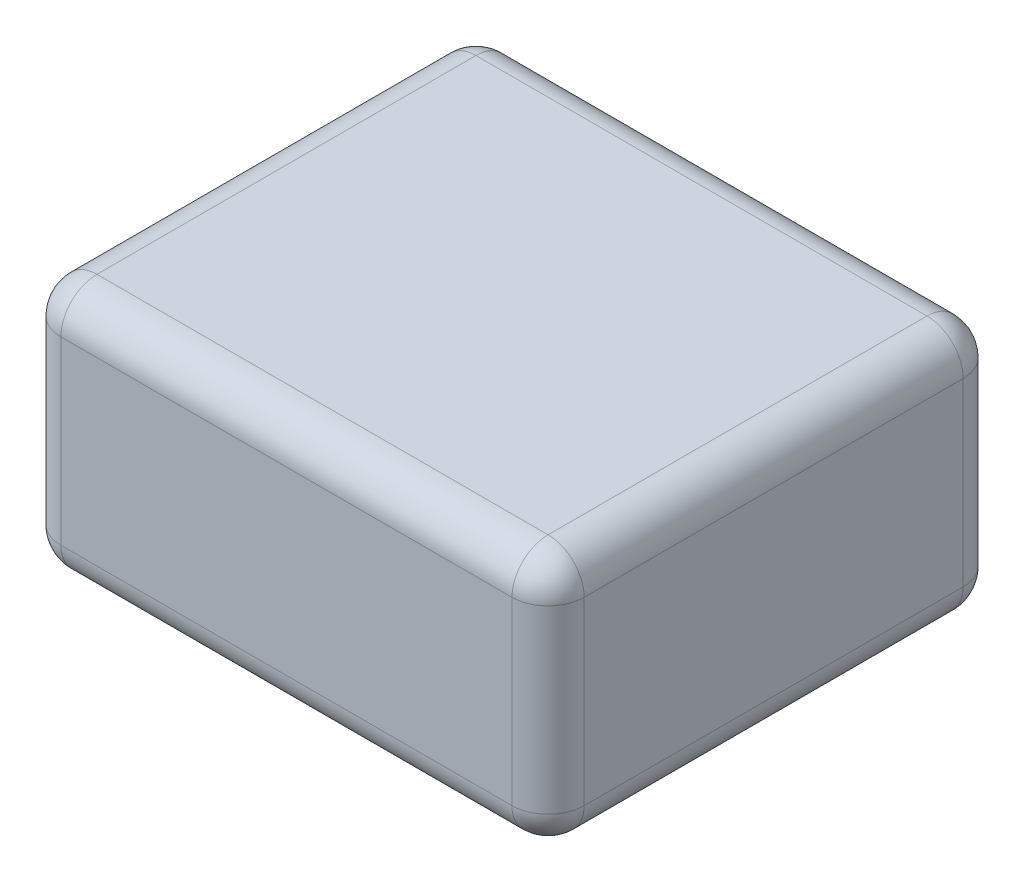
ISO-10303-21;
HEADER;
FILE_DESCRIPTION(('STEP AP214'),'2;1');
FILE_NAME('part.step','',(''),(''),'','','');
FILE_SCHEMA(('AUTOMOTIVE_DESIGN { 1 0 10303 214 1 1 1 1 }'));
ENDSEC;
DATA;
#1=APPLICATION_CONTEXT('core data for automotive mechanical design processes');
#2=APPLICATION_PROTOCOL_DEFINITION('international standard','automotive_design',2000,#1);
#3=PRODUCT_CONTEXT('',#1,'mechanical');
#4=PRODUCT('Part','Part','',(#3));
#5=PRODUCT_RELATED_PRODUCT_CATEGORY('part','',(#4));
#6=PRODUCT_DEFINITION_FORMATION('','',#4);
#7=PRODUCT_DEFINITION_CONTEXT('part definition',#1,'design');
#8=PRODUCT_DEFINITION('design','',#6,#7);
#9=PRODUCT_DEFINITION_SHAPE('','',#8);
#10=(LENGTH_UNIT() NAMED_UNIT(*) SI_UNIT(.MILLI.,.METRE.));
#11=(NAMED_UNIT(*) PLANE_ANGLE_UNIT() SI_UNIT($,.RADIAN.));
#12=(NAMED_UNIT(*) SI_UNIT($,.STERADIAN.) SOLID_ANGLE_UNIT());
#13=UNCERTAINTY_MEASURE_WITH_UNIT(LENGTH_MEASURE(1.E-05),#10,'distance_accuracy_value','');
#14=(GEOMETRIC_REPRESENTATION_CONTEXT(3) GLOBAL_UNCERTAINTY_ASSIGNED_CONTEXT((#13)) GLOBAL_UNIT_ASSIGNED_CONTEXT((#10,
#11,#12)) REPRESENTATION_CONTEXT('',''));
#15=CARTESIAN_POINT('',(0.,0.,0.));
#16=DIRECTION('',(0.,0.,1.));
#17=DIRECTION('',(1.,0.,0.));
#18=AXIS2_PLACEMENT_3D('',#15,#16,#17);
#19=CARTESIAN_POINT('',(92.075,88.9,-79.375));
#20=DIRECTION('',(-1.,0.,0.));
#21=DIRECTION('',(0.,0.,1.));
#22=AXIS2_PLACEMENT_3D('',#19,#20,#21);
#23=PLANE('',#22);
#24=DIRECTION('',(0.,0.,-1.));
#25=VECTOR('',#24,1.);
#26=CARTESIAN_POINT('',(92.075,12.7,-79.375));
#27=LINE('',#26,#25);
#28=CARTESIAN_POINT('',(92.075,12.7,66.675));
#29=VERTEX_POINT('',#28);
#30=CARTESIAN_POINT('',(92.075,12.7,-66.675));
#31=VERTEX_POINT('',#30);
#32=EDGE_CURVE('E183',#29,#31,#27,.T.);
#33=ORIENTED_EDGE('',*,*,#32,.T.);
#34=DIRECTION('',(0.,-1.,0.));
#35=VECTOR('',#34,1.);
#36=CARTESIAN_POINT('',(92.075,88.9,-66.675));
#37=LINE('',#36,#35);
#38=CARTESIAN_POINT('',(92.075,76.2,-66.675));
#39=VERTEX_POINT('',#38);
#40=EDGE_CURVE('E185',#31,#39,#37,.F.);
#41=ORIENTED_EDGE('',*,*,#40,.T.);
#42=DIRECTION('',(0.,0.,-1.));
#43=VECTOR('',#42,1.);
#44=CARTESIAN_POINT('',(92.075,76.2,79.375));
#45=LINE('',#44,#43);
#46=CARTESIAN_POINT('',(92.075,76.2,66.675));
#47=VERTEX_POINT('',#46);
#48=EDGE_CURVE('E181',#39,#47,#45,.F.);
#49=ORIENTED_EDGE('',*,*,#48,.T.);
#50=DIRECTION('',(0.,-1.,0.));
#51=VECTOR('',#50,1.);
#52=CARTESIAN_POINT('',(92.075,88.9,66.675));
#53=LINE('',#52,#51);
#54=EDGE_CURVE('E179',#47,#29,#53,.T.);
#55=ORIENTED_EDGE('',*,*,#54,.T.);
#56=EDGE_LOOP('',(#33,#41,#49,#55));
#57=FACE_BOUND('',#56,.T.);
#58=ADVANCED_FACE('F35',(#57),#23,.F.);
#59=CARTESIAN_POINT('',(-92.075,88.9,-79.375));
#60=DIRECTION('',(0.,0.,1.));
#61=DIRECTION('',(1.,0.,0.));
#62=AXIS2_PLACEMENT_3D('',#59,#60,#61);
#63=PLANE('',#62);
#64=DIRECTION('',(-1.,0.,0.));
#65=VECTOR('',#64,1.);
#66=CARTESIAN_POINT('',(-92.075,12.7,-79.375));
#67=LINE('',#66,#65);
#68=CARTESIAN_POINT('',(79.375,12.7,-79.375));
#69=VERTEX_POINT('',#68);
#70=CARTESIAN_POINT('',(-79.375,12.7,-79.375));
#71=VERTEX_POINT('',#70);
#72=EDGE_CURVE('E174',#69,#71,#67,.T.);
#73=ORIENTED_EDGE('',*,*,#72,.T.);
#74=DIRECTION('',(0.,-1.,0.));
#75=VECTOR('',#74,1.);
#76=CARTESIAN_POINT('',(-79.375,88.9,-79.375));
#77=LINE('',#76,#75);
#78=CARTESIAN_POINT('',(-79.375,76.2,-79.375));
#79=VERTEX_POINT('',#78);
#80=EDGE_CURVE('E176',#71,#79,#77,.F.);
#81=ORIENTED_EDGE('',*,*,#80,.T.);
#82=DIRECTION('',(-1.,0.,0.));
#83=VECTOR('',#82,1.);
#84=CARTESIAN_POINT('',(92.075,76.2,-79.375));
#85=LINE('',#84,#83);
#86=CARTESIAN_POINT('',(79.375,76.2,-79.375));
#87=VERTEX_POINT('',#86);
#88=EDGE_CURVE('E170',#79,#87,#85,.F.);
#89=ORIENTED_EDGE('',*,*,#88,.T.);
#90=DIRECTION('',(0.,-1.,0.));
#91=VECTOR('',#90,1.);
#92=CARTESIAN_POINT('',(79.375,88.9,-79.375));
#93=LINE('',#92,#91);
#94=EDGE_CURVE('E172',#87,#69,#93,.T.);
#95=ORIENTED_EDGE('',*,*,#94,.T.);
#96=EDGE_LOOP('',(#73,#81,#89,#95));
#97=FACE_BOUND('',#96,.T.);
#98=ADVANCED_FACE('F288',(#97),#63,.F.);
#99=CARTESIAN_POINT('',(-92.075,88.9,-79.375));
#100=DIRECTION('',(1.,0.,0.));
#101=DIRECTION('',(0.,0.,-1.));
#102=AXIS2_PLACEMENT_3D('',#99,#100,#101);
#103=PLANE('',#102);
#104=DIRECTION('',(0.,-1.,0.));
#105=VECTOR('',#104,1.);
#106=CARTESIAN_POINT('',(-92.075,88.9,-66.675));
#107=LINE('',#106,#105);
#108=CARTESIAN_POINT('',(-92.075,76.2,-66.675));
#109=VERTEX_POINT('',#108);
#110=CARTESIAN_POINT('',(-92.075,12.7,-66.675));
#111=VERTEX_POINT('',#110);
#112=EDGE_CURVE('E157',#109,#111,#107,.T.);
#113=ORIENTED_EDGE('',*,*,#112,.T.);
#114=DIRECTION('',(0.,0.,1.));
#115=VECTOR('',#114,1.);
#116=CARTESIAN_POINT('',(-92.075,12.7,-79.375));
#117=LINE('',#116,#115);
#118=CARTESIAN_POINT('',(-92.075,12.7,66.675));
#119=VERTEX_POINT('',#118);
#120=EDGE_CURVE('E129',#111,#119,#117,.T.);
#121=ORIENTED_EDGE('',*,*,#120,.T.);
#122=DIRECTION('',(0.,-1.,0.));
#123=VECTOR('',#122,1.);
#124=CARTESIAN_POINT('',(-92.075,88.9,66.675));
#125=LINE('',#124,#123);
#126=CARTESIAN_POINT('',(-92.075,76.2,66.675));
#127=VERTEX_POINT('',#126);
#128=EDGE_CURVE('E147',#119,#127,#125,.F.);
#129=ORIENTED_EDGE('',*,*,#128,.T.);
#130=DIRECTION('',(0.,0.,1.));
#131=VECTOR('',#130,1.);
#132=CARTESIAN_POINT('',(-92.075,76.2,-79.375));
#133=LINE('',#132,#131);
#134=EDGE_CURVE('E153',#127,#109,#133,.F.);
#135=ORIENTED_EDGE('',*,*,#134,.T.);
#136=EDGE_LOOP('',(#113,#121,#129,#135));
#137=FACE_BOUND('',#136,.T.);
#138=ADVANCED_FACE('F155',(#137),#103,.F.);
#139=CARTESIAN_POINT('',(-92.075,88.9,79.375));
#140=DIRECTION('',(0.,0.,-1.));
#141=DIRECTION('',(-1.,0.,0.));
#142=AXIS2_PLACEMENT_3D('',#139,#140,#141);
#143=PLANE('',#142);
#144=DIRECTION('',(1.,0.,0.));
#145=VECTOR('',#144,1.);
#146=CARTESIAN_POINT('',(-92.075,76.2,79.375));
#147=LINE('',#146,#145);
#148=CARTESIAN_POINT('',(79.375,76.2,79.375));
#149=VERTEX_POINT('',#148);
#150=CARTESIAN_POINT('',(-79.375,76.2,79.375));
#151=VERTEX_POINT('',#150);
#152=EDGE_CURVE('E44',#149,#151,#147,.F.);
#153=ORIENTED_EDGE('',*,*,#152,.T.);
#154=DIRECTION('',(0.,-1.,0.));
#155=VECTOR('',#154,1.);
#156=CARTESIAN_POINT('',(-79.375,88.9,79.375));
#157=LINE('',#156,#155);
#158=CARTESIAN_POINT('',(-79.375,12.7,79.375));
#159=VERTEX_POINT('',#158);
#160=EDGE_CURVE('E11',#151,#159,#157,.T.);
#161=ORIENTED_EDGE('',*,*,#160,.T.);
#162=DIRECTION('',(1.,0.,0.));
#163=VECTOR('',#162,1.);
#164=CARTESIAN_POINT('',(-92.075,12.7,79.375));
#165=LINE('',#164,#163);
#166=CARTESIAN_POINT('',(79.375,12.7,79.375));
#167=VERTEX_POINT('',#166);
#168=EDGE_CURVE('E197',#159,#167,#165,.T.);
#169=ORIENTED_EDGE('',*,*,#168,.T.);
#170=DIRECTION('',(0.,-1.,0.));
#171=VECTOR('',#170,1.);
#172=CARTESIAN_POINT('',(79.375,88.9,79.375));
#173=LINE('',#172,#171);
#174=EDGE_CURVE('E55',#167,#149,#173,.F.);
#175=ORIENTED_EDGE('',*,*,#174,.T.);
#176=EDGE_LOOP('',(#153,#161,#169,#175));
#177=FACE_BOUND('',#176,.T.);
#178=ADVANCED_FACE('F328',(#177),#143,.F.);
#179=CARTESIAN_POINT('',(0.,88.9,0.));
#180=DIRECTION('',(0.,1.,0.));
#181=DIRECTION('',(0.,0.,1.));
#182=AXIS2_PLACEMENT_3D('',#179,#180,#181);
#183=PLANE('',#182);
#184=DIRECTION('',(-1.,0.,0.));
#185=VECTOR('',#184,1.);
#186=CARTESIAN_POINT('',(-92.075,88.9,-66.675));
#187=LINE('',#186,#185);
#188=CARTESIAN_POINT('',(79.375,88.9,-66.675));
#189=VERTEX_POINT('',#188);
#190=CARTESIAN_POINT('',(-79.375,88.9,-66.675));
#191=VERTEX_POINT('',#190);
#192=EDGE_CURVE('E192',#189,#191,#187,.T.);
#193=ORIENTED_EDGE('',*,*,#192,.T.);
#194=DIRECTION('',(0.,0.,1.));
#195=VECTOR('',#194,1.);
#196=CARTESIAN_POINT('',(-79.375,88.9,79.375));
#197=LINE('',#196,#195);
#198=CARTESIAN_POINT('',(-79.375,88.9,66.675));
#199=VERTEX_POINT('',#198);
#200=EDGE_CURVE('E194',#191,#199,#197,.T.);
#201=ORIENTED_EDGE('',*,*,#200,.T.);
#202=DIRECTION('',(1.,0.,0.));
#203=VECTOR('',#202,1.);
#204=CARTESIAN_POINT('',(92.075,88.9,66.675));
#205=LINE('',#204,#203);
#206=CARTESIAN_POINT('',(79.375,88.9,66.675));
#207=VERTEX_POINT('',#206);
#208=EDGE_CURVE('E188',#199,#207,#205,.T.);
#209=ORIENTED_EDGE('',*,*,#208,.T.);
#210=DIRECTION('',(0.,0.,-1.));
#211=VECTOR('',#210,1.);
#212=CARTESIAN_POINT('',(79.375,88.9,-79.375));
#213=LINE('',#212,#211);
#214=EDGE_CURVE('E190',#207,#189,#213,.T.);
#215=ORIENTED_EDGE('',*,*,#214,.T.);
#216=EDGE_LOOP('',(#193,#201,#209,#215));
#217=FACE_BOUND('',#216,.T.);
#218=ADVANCED_FACE('F302',(#217),#183,.T.);
#219=CARTESIAN_POINT('',(0.,0.,0.));
#220=DIRECTION('',(0.,1.,0.));
#221=DIRECTION('',(0.,0.,1.));
#222=AXIS2_PLACEMENT_3D('',#219,#220,#221);
#223=PLANE('',#222);
#224=DIRECTION('',(1.,0.,0.));
#225=VECTOR('',#224,1.);
#226=CARTESIAN_POINT('',(0.,0.,66.675));
#227=LINE('',#226,#225);
#228=CARTESIAN_POINT('',(79.375,0.,66.675));
#229=VERTEX_POINT('',#228);
#230=CARTESIAN_POINT('',(-79.375,0.,66.675));
#231=VERTEX_POINT('',#230);
#232=EDGE_CURVE('E159',#229,#231,#227,.F.);
#233=ORIENTED_EDGE('',*,*,#232,.T.);
#234=DIRECTION('',(0.,0.,1.));
#235=VECTOR('',#234,1.);
#236=CARTESIAN_POINT('',(-79.375,0.,0.));
#237=LINE('',#236,#235);
#238=CARTESIAN_POINT('',(-79.375,0.,-66.675));
#239=VERTEX_POINT('',#238);
#240=EDGE_CURVE('E131',#231,#239,#237,.F.);
#241=ORIENTED_EDGE('',*,*,#240,.T.);
#242=DIRECTION('',(-1.,0.,0.));
#243=VECTOR('',#242,1.);
#244=CARTESIAN_POINT('',(0.,0.,-66.675));
#245=LINE('',#244,#243);
#246=CARTESIAN_POINT('',(79.375,0.,-66.675));
#247=VERTEX_POINT('',#246);
#248=EDGE_CURVE('E167',#239,#247,#245,.F.);
#249=ORIENTED_EDGE('',*,*,#248,.T.);
#250=DIRECTION('',(0.,0.,-1.));
#251=VECTOR('',#250,1.);
#252=CARTESIAN_POINT('',(79.375,0.,0.));
#253=LINE('',#252,#251);
#254=EDGE_CURVE('E161',#247,#229,#253,.F.);
#255=ORIENTED_EDGE('',*,*,#254,.T.);
#256=EDGE_LOOP('',(#233,#241,#249,#255));
#257=FACE_BOUND('',#256,.T.);
#258=ADVANCED_FACE('F321',(#257),#223,.F.);
#259=CARTESIAN_POINT('',(79.375,76.2,0.));
#260=DIRECTION('',(0.,0.,1.));
#261=DIRECTION('',(1.,0.,0.));
#262=AXIS2_PLACEMENT_3D('',#259,#260,#261);
#263=CYLINDRICAL_SURFACE('',#262,12.7);
#264=CARTESIAN_POINT('',(79.375,76.2,-66.675));
#265=DIRECTION('',(0.,0.,-1.));
#266=DIRECTION('',(-1.,0.,0.));
#267=AXIS2_PLACEMENT_3D('',#264,#265,#266);
#268=CIRCLE('',#267,12.7);
#269=EDGE_CURVE('E39',#189,#39,#268,.T.);
#270=ORIENTED_EDGE('',*,*,#269,.F.);
#271=ORIENTED_EDGE('',*,*,#214,.F.);
#272=CARTESIAN_POINT('',(79.375,76.2,66.675));
#273=DIRECTION('',(0.,0.,1.));
#274=DIRECTION('',(0.,-1.,0.));
#275=AXIS2_PLACEMENT_3D('',#272,#273,#274);
#276=CIRCLE('',#275,12.7);
#277=EDGE_CURVE('E249',#47,#207,#276,.T.);
#278=ORIENTED_EDGE('',*,*,#277,.F.);
#279=ORIENTED_EDGE('',*,*,#48,.F.);
#280=EDGE_LOOP('',(#270,#271,#278,#279));
#281=FACE_BOUND('',#280,.T.);
#282=ADVANCED_FACE('F37',(#281),#263,.T.);
#283=CARTESIAN_POINT('',(79.375,76.2,-66.675));
#284=DIRECTION('',(1.,0.,0.));
#285=DIRECTION('',(0.,0.,-1.));
#286=AXIS2_PLACEMENT_3D('',#283,#284,#285);
#287=SPHERICAL_SURFACE('',#286,12.7);
#288=CARTESIAN_POINT('',(79.375,76.2,-66.675));
#289=DIRECTION('',(1.,0.,0.));
#290=DIRECTION('',(0.,1.,0.));
#291=AXIS2_PLACEMENT_3D('',#288,#289,#290);
#292=CIRCLE('',#291,12.7);
#293=EDGE_CURVE('E245',#189,#87,#292,.F.);
#294=ORIENTED_EDGE('',*,*,#293,.F.);
#295=ORIENTED_EDGE('',*,*,#269,.T.);
#296=CARTESIAN_POINT('',(79.375,76.2,-66.675));
#297=DIRECTION('',(0.,1.,0.));
#298=DIRECTION('',(0.,0.,1.));
#299=AXIS2_PLACEMENT_3D('',#296,#297,#298);
#300=CIRCLE('',#299,12.7);
#301=EDGE_CURVE('E248',#87,#39,#300,.F.);
#302=ORIENTED_EDGE('',*,*,#301,.F.);
#303=EDGE_LOOP('',(#294,#295,#302));
#304=FACE_BOUND('',#303,.T.);
#305=ADVANCED_FACE('F261',(#304),#287,.T.);
#306=CARTESIAN_POINT('',(79.375,76.2,66.675));
#307=DIRECTION('',(0.,1.,0.));
#308=DIRECTION('',(0.,0.,1.));
#309=AXIS2_PLACEMENT_3D('',#306,#307,#308);
#310=SPHERICAL_SURFACE('',#309,12.7);
#311=CARTESIAN_POINT('',(79.375,76.2,66.675));
#312=DIRECTION('',(0.,1.,0.));
#313=DIRECTION('',(0.,0.,1.));
#314=AXIS2_PLACEMENT_3D('',#311,#312,#313);
#315=CIRCLE('',#314,12.7);
#316=EDGE_CURVE('E240',#47,#149,#315,.F.);
#317=ORIENTED_EDGE('',*,*,#316,.F.);
#318=ORIENTED_EDGE('',*,*,#277,.T.);
#319=CARTESIAN_POINT('',(79.375,76.2,66.675));
#320=DIRECTION('',(1.,0.,0.));
#321=DIRECTION('',(0.,0.,-1.));
#322=AXIS2_PLACEMENT_3D('',#319,#320,#321);
#323=CIRCLE('',#322,12.7);
#324=EDGE_CURVE('E242',#149,#207,#323,.F.);
#325=ORIENTED_EDGE('',*,*,#324,.F.);
#326=EDGE_LOOP('',(#317,#318,#325));
#327=FACE_BOUND('',#326,.T.);
#328=ADVANCED_FACE('F310',(#327),#310,.T.);
#329=CARTESIAN_POINT('',(79.375,88.9,-66.675));
#330=DIRECTION('',(0.,-1.,0.));
#331=DIRECTION('',(0.,0.,-1.));
#332=AXIS2_PLACEMENT_3D('',#329,#330,#331);
#333=CYLINDRICAL_SURFACE('',#332,12.7);
#334=ORIENTED_EDGE('',*,*,#301,.T.);
#335=ORIENTED_EDGE('',*,*,#40,.F.);
#336=CARTESIAN_POINT('',(79.375,12.7,-66.675));
#337=DIRECTION('',(0.,-1.,0.));
#338=DIRECTION('',(0.,0.,-1.));
#339=AXIS2_PLACEMENT_3D('',#336,#337,#338);
#340=CIRCLE('',#339,12.7);
#341=EDGE_CURVE('E234',#69,#31,#340,.T.);
#342=ORIENTED_EDGE('',*,*,#341,.F.);
#343=ORIENTED_EDGE('',*,*,#94,.F.);
#344=EDGE_LOOP('',(#334,#335,#342,#343));
#345=FACE_BOUND('',#344,.T.);
#346=ADVANCED_FACE('F272',(#345),#333,.T.);
#347=CARTESIAN_POINT('',(0.,76.2,-66.675));
#348=DIRECTION('',(1.,0.,0.));
#349=DIRECTION('',(0.,0.,-1.));
#350=AXIS2_PLACEMENT_3D('',#347,#348,#349);
#351=CYLINDRICAL_SURFACE('',#350,12.7);
#352=ORIENTED_EDGE('',*,*,#293,.T.);
#353=ORIENTED_EDGE('',*,*,#88,.F.);
#354=CARTESIAN_POINT('',(-79.375,76.2,-66.675));
#355=DIRECTION('',(-1.,0.,0.));
#356=DIRECTION('',(0.,0.,1.));
#357=AXIS2_PLACEMENT_3D('',#354,#355,#356);
#358=CIRCLE('',#357,12.7);
#359=EDGE_CURVE('E231',#191,#79,#358,.T.);
#360=ORIENTED_EDGE('',*,*,#359,.F.);
#361=ORIENTED_EDGE('',*,*,#192,.F.);
#362=EDGE_LOOP('',(#352,#353,#360,#361));
#363=FACE_BOUND('',#362,.T.);
#364=ADVANCED_FACE('F299',(#363),#351,.T.);
#365=CARTESIAN_POINT('',(-79.375,76.2,0.));
#366=DIRECTION('',(0.,0.,-1.));
#367=DIRECTION('',(-1.,0.,0.));
#368=AXIS2_PLACEMENT_3D('',#365,#366,#367);
#369=CYLINDRICAL_SURFACE('',#368,12.7);
#370=CARTESIAN_POINT('',(-79.375,76.2,66.675));
#371=DIRECTION('',(0.,0.,1.));
#372=DIRECTION('',(1.,0.,0.));
#373=AXIS2_PLACEMENT_3D('',#370,#371,#372);
#374=CIRCLE('',#373,12.7);
#375=EDGE_CURVE('E225',#199,#127,#374,.T.);
#376=ORIENTED_EDGE('',*,*,#375,.F.);
#377=ORIENTED_EDGE('',*,*,#200,.F.);
#378=CARTESIAN_POINT('',(-79.375,76.2,-66.675));
#379=DIRECTION('',(0.,0.,-1.));
#380=DIRECTION('',(-1.,0.,0.));
#381=AXIS2_PLACEMENT_3D('',#378,#379,#380);
#382=CIRCLE('',#381,12.7);
#383=EDGE_CURVE('E228',#109,#191,#382,.T.);
#384=ORIENTED_EDGE('',*,*,#383,.F.);
#385=ORIENTED_EDGE('',*,*,#134,.F.);
#386=EDGE_LOOP('',(#376,#377,#384,#385));
#387=FACE_BOUND('',#386,.T.);
#388=ADVANCED_FACE('F305',(#387),#369,.T.);
#389=CARTESIAN_POINT('',(0.,76.2,66.675));
#390=DIRECTION('',(-1.,0.,0.));
#391=DIRECTION('',(0.,0.,1.));
#392=AXIS2_PLACEMENT_3D('',#389,#390,#391);
#393=CYLINDRICAL_SURFACE('',#392,12.7);
#394=ORIENTED_EDGE('',*,*,#324,.T.);
#395=ORIENTED_EDGE('',*,*,#208,.F.);
#396=CARTESIAN_POINT('',(-79.375,76.2,66.675));
#397=DIRECTION('',(-1.,0.,0.));
#398=DIRECTION('',(0.,0.,1.));
#399=AXIS2_PLACEMENT_3D('',#396,#397,#398);
#400=CIRCLE('',#399,12.7);
#401=EDGE_CURVE('E223',#151,#199,#400,.T.);
#402=ORIENTED_EDGE('',*,*,#401,.F.);
#403=ORIENTED_EDGE('',*,*,#152,.F.);
#404=EDGE_LOOP('',(#394,#395,#402,#403));
#405=FACE_BOUND('',#404,.T.);
#406=ADVANCED_FACE('F309',(#405),#393,.T.);
#407=CARTESIAN_POINT('',(79.375,88.9,66.675));
#408=DIRECTION('',(0.,-1.,0.));
#409=DIRECTION('',(0.,0.,-1.));
#410=AXIS2_PLACEMENT_3D('',#407,#408,#409);
#411=CYLINDRICAL_SURFACE('',#410,12.7);
#412=ORIENTED_EDGE('',*,*,#316,.T.);
#413=ORIENTED_EDGE('',*,*,#174,.F.);
#414=CARTESIAN_POINT('',(79.375,12.7,66.675));
#415=DIRECTION('',(0.,-1.,0.));
#416=DIRECTION('',(0.,0.,-1.));
#417=AXIS2_PLACEMENT_3D('',#414,#415,#416);
#418=CIRCLE('',#417,12.7);
#419=EDGE_CURVE('E220',#29,#167,#418,.T.);
#420=ORIENTED_EDGE('',*,*,#419,.F.);
#421=ORIENTED_EDGE('',*,*,#54,.F.);
#422=EDGE_LOOP('',(#412,#413,#420,#421));
#423=FACE_BOUND('',#422,.T.);
#424=ADVANCED_FACE('F313',(#423),#411,.T.);
#425=CARTESIAN_POINT('',(79.375,12.7,-79.375));
#426=DIRECTION('',(0.,0.,-1.));
#427=DIRECTION('',(-1.,0.,0.));
#428=AXIS2_PLACEMENT_3D('',#425,#426,#427);
#429=CYLINDRICAL_SURFACE('',#428,12.7);
#430=CARTESIAN_POINT('',(79.375,12.7,-66.675));
#431=DIRECTION('',(0.,0.,-1.));
#432=DIRECTION('',(-1.,0.,0.));
#433=AXIS2_PLACEMENT_3D('',#430,#431,#432);
#434=CIRCLE('',#433,12.7);
#435=EDGE_CURVE('E237',#31,#247,#434,.T.);
#436=ORIENTED_EDGE('',*,*,#435,.F.);
#437=ORIENTED_EDGE('',*,*,#32,.F.);
#438=CARTESIAN_POINT('',(79.375,12.7,66.675));
#439=DIRECTION('',(0.,0.,1.));
#440=DIRECTION('',(1.,0.,0.));
#441=AXIS2_PLACEMENT_3D('',#438,#439,#440);
#442=CIRCLE('',#441,12.7);
#443=EDGE_CURVE('E217',#229,#29,#442,.T.);
#444=ORIENTED_EDGE('',*,*,#443,.F.);
#445=ORIENTED_EDGE('',*,*,#254,.F.);
#446=EDGE_LOOP('',(#436,#437,#444,#445));
#447=FACE_BOUND('',#446,.T.);
#448=ADVANCED_FACE('F276',(#447),#429,.T.);
#449=CARTESIAN_POINT('',(79.375,12.7,-66.675));
#450=DIRECTION('',(1.,0.,0.));
#451=DIRECTION('',(0.,1.,0.));
#452=AXIS2_PLACEMENT_3D('',#449,#450,#451);
#453=SPHERICAL_SURFACE('',#452,12.7);
#454=ORIENTED_EDGE('',*,*,#341,.T.);
#455=ORIENTED_EDGE('',*,*,#435,.T.);
#456=CARTESIAN_POINT('',(79.375,12.7,-66.675));
#457=DIRECTION('',(1.,0.,0.));
#458=DIRECTION('',(0.,0.,-1.));
#459=AXIS2_PLACEMENT_3D('',#456,#457,#458);
#460=CIRCLE('',#459,12.7);
#461=EDGE_CURVE('E214',#69,#247,#460,.F.);
#462=ORIENTED_EDGE('',*,*,#461,.F.);
#463=EDGE_LOOP('',(#454,#455,#462));
#464=FACE_BOUND('',#463,.T.);
#465=ADVANCED_FACE('F280',(#464),#453,.T.);
#466=CARTESIAN_POINT('',(-79.375,76.2,-66.675));
#467=DIRECTION('',(0.,1.,0.));
#468=DIRECTION('',(0.,0.,1.));
#469=AXIS2_PLACEMENT_3D('',#466,#467,#468);
#470=SPHERICAL_SURFACE('',#469,12.7);
#471=ORIENTED_EDGE('',*,*,#383,.T.);
#472=ORIENTED_EDGE('',*,*,#359,.T.);
#473=CARTESIAN_POINT('',(-79.375,76.2,-66.675));
#474=DIRECTION('',(0.,1.,0.));
#475=DIRECTION('',(0.,0.,1.));
#476=AXIS2_PLACEMENT_3D('',#473,#474,#475);
#477=CIRCLE('',#476,12.7);
#478=EDGE_CURVE('E212',#109,#79,#477,.F.);
#479=ORIENTED_EDGE('',*,*,#478,.F.);
#480=EDGE_LOOP('',(#471,#472,#479));
#481=FACE_BOUND('',#480,.T.);
#482=ADVANCED_FACE('F296',(#481),#470,.T.);
#483=CARTESIAN_POINT('',(-79.375,76.2,66.675));
#484=DIRECTION('',(0.,1.,0.));
#485=DIRECTION('',(0.,0.,1.));
#486=AXIS2_PLACEMENT_3D('',#483,#484,#485);
#487=SPHERICAL_SURFACE('',#486,12.7);
#488=ORIENTED_EDGE('',*,*,#401,.T.);
#489=ORIENTED_EDGE('',*,*,#375,.T.);
#490=CARTESIAN_POINT('',(-79.375,76.2,66.675));
#491=DIRECTION('',(0.,1.,0.));
#492=DIRECTION('',(0.,0.,1.));
#493=AXIS2_PLACEMENT_3D('',#490,#491,#492);
#494=CIRCLE('',#493,12.7);
#495=EDGE_CURVE('E150',#151,#127,#494,.F.);
#496=ORIENTED_EDGE('',*,*,#495,.F.);
#497=EDGE_LOOP('',(#488,#489,#496));
#498=FACE_BOUND('',#497,.T.);
#499=ADVANCED_FACE('F357',(#498),#487,.T.);
#500=CARTESIAN_POINT('',(79.375,12.7,66.675));
#501=DIRECTION('',(1.,0.,0.));
#502=DIRECTION('',(0.,0.,-1.));
#503=AXIS2_PLACEMENT_3D('',#500,#501,#502);
#504=SPHERICAL_SURFACE('',#503,12.7);
#505=ORIENTED_EDGE('',*,*,#443,.T.);
#506=ORIENTED_EDGE('',*,*,#419,.T.);
#507=CARTESIAN_POINT('',(79.375,12.7,66.675));
#508=DIRECTION('',(1.,0.,0.));
#509=DIRECTION('',(0.,0.,-1.));
#510=AXIS2_PLACEMENT_3D('',#507,#508,#509);
#511=CIRCLE('',#510,12.7);
#512=EDGE_CURVE('E208',#229,#167,#511,.F.);
#513=ORIENTED_EDGE('',*,*,#512,.F.);
#514=EDGE_LOOP('',(#505,#506,#513));
#515=FACE_BOUND('',#514,.T.);
#516=ADVANCED_FACE('F316',(#515),#504,.T.);
#517=CARTESIAN_POINT('',(-92.075,12.7,-66.675));
#518=DIRECTION('',(-1.,0.,0.));
#519=DIRECTION('',(0.,0.,1.));
#520=AXIS2_PLACEMENT_3D('',#517,#518,#519);
#521=CYLINDRICAL_SURFACE('',#520,12.7);
#522=ORIENTED_EDGE('',*,*,#461,.T.);
#523=ORIENTED_EDGE('',*,*,#248,.F.);
#524=CARTESIAN_POINT('',(-79.375,12.7,-66.675));
#525=DIRECTION('',(-1.,0.,0.));
#526=DIRECTION('',(0.,0.,1.));
#527=AXIS2_PLACEMENT_3D('',#524,#525,#526);
#528=CIRCLE('',#527,12.7);
#529=EDGE_CURVE('E205',#71,#239,#528,.T.);
#530=ORIENTED_EDGE('',*,*,#529,.F.);
#531=ORIENTED_EDGE('',*,*,#72,.F.);
#532=EDGE_LOOP('',(#522,#523,#530,#531));
#533=FACE_BOUND('',#532,.T.);
#534=ADVANCED_FACE('F285',(#533),#521,.T.);
#535=CARTESIAN_POINT('',(-79.375,88.9,-66.675));
#536=DIRECTION('',(0.,-1.,0.));
#537=DIRECTION('',(0.,0.,-1.));
#538=AXIS2_PLACEMENT_3D('',#535,#536,#537);
#539=CYLINDRICAL_SURFACE('',#538,12.7);
#540=ORIENTED_EDGE('',*,*,#478,.T.);
#541=ORIENTED_EDGE('',*,*,#80,.F.);
#542=CARTESIAN_POINT('',(-79.375,12.7,-66.675));
#543=DIRECTION('',(0.,-1.,0.));
#544=DIRECTION('',(0.,0.,-1.));
#545=AXIS2_PLACEMENT_3D('',#542,#543,#544);
#546=CIRCLE('',#545,12.7);
#547=EDGE_CURVE('E144',#111,#71,#546,.T.);
#548=ORIENTED_EDGE('',*,*,#547,.F.);
#549=ORIENTED_EDGE('',*,*,#112,.F.);
#550=EDGE_LOOP('',(#540,#541,#548,#549));
#551=FACE_BOUND('',#550,.T.);
#552=ADVANCED_FACE('F290',(#551),#539,.T.);
#553=CARTESIAN_POINT('',(-79.375,88.9,66.675));
#554=DIRECTION('',(0.,-1.,0.));
#555=DIRECTION('',(0.,0.,-1.));
#556=AXIS2_PLACEMENT_3D('',#553,#554,#555);
#557=CYLINDRICAL_SURFACE('',#556,12.7);
#558=ORIENTED_EDGE('',*,*,#495,.T.);
#559=ORIENTED_EDGE('',*,*,#128,.F.);
#560=CARTESIAN_POINT('',(-79.375,12.7,66.675));
#561=DIRECTION('',(0.,-1.,0.));
#562=DIRECTION('',(0.,0.,-1.));
#563=AXIS2_PLACEMENT_3D('',#560,#561,#562);
#564=CIRCLE('',#563,12.7);
#565=EDGE_CURVE('E136',#159,#119,#564,.T.);
#566=ORIENTED_EDGE('',*,*,#565,.F.);
#567=ORIENTED_EDGE('',*,*,#160,.F.);
#568=EDGE_LOOP('',(#558,#559,#566,#567));
#569=FACE_BOUND('',#568,.T.);
#570=ADVANCED_FACE('F148',(#569),#557,.T.);
#571=CARTESIAN_POINT('',(-92.075,12.7,66.675));
#572=DIRECTION('',(1.,0.,0.));
#573=DIRECTION('',(0.,0.,-1.));
#574=AXIS2_PLACEMENT_3D('',#571,#572,#573);
#575=CYLINDRICAL_SURFACE('',#574,12.7);
#576=ORIENTED_EDGE('',*,*,#512,.T.);
#577=ORIENTED_EDGE('',*,*,#168,.F.);
#578=CARTESIAN_POINT('',(-79.375,12.7,66.675));
#579=DIRECTION('',(-1.,0.,0.));
#580=DIRECTION('',(0.,0.,1.));
#581=AXIS2_PLACEMENT_3D('',#578,#579,#580);
#582=CIRCLE('',#581,12.7);
#583=EDGE_CURVE('E140',#231,#159,#582,.T.);
#584=ORIENTED_EDGE('',*,*,#583,.F.);
#585=ORIENTED_EDGE('',*,*,#232,.F.);
#586=EDGE_LOOP('',(#576,#577,#584,#585));
#587=FACE_BOUND('',#586,.T.);
#588=ADVANCED_FACE('F319',(#587),#575,.T.);
#589=CARTESIAN_POINT('',(-79.375,12.7,-66.675));
#590=DIRECTION('',(0.,0.,-1.));
#591=DIRECTION('',(0.,1.,0.));
#592=AXIS2_PLACEMENT_3D('',#589,#590,#591);
#593=SPHERICAL_SURFACE('',#592,12.7);
#594=ORIENTED_EDGE('',*,*,#547,.T.);
#595=ORIENTED_EDGE('',*,*,#529,.T.);
#596=CARTESIAN_POINT('',(-79.375,12.7,-66.675));
#597=DIRECTION('',(0.,0.,-1.));
#598=DIRECTION('',(-1.,0.,0.));
#599=AXIS2_PLACEMENT_3D('',#596,#597,#598);
#600=CIRCLE('',#599,12.7);
#601=EDGE_CURVE('E133',#111,#239,#600,.F.);
#602=ORIENTED_EDGE('',*,*,#601,.F.);
#603=EDGE_LOOP('',(#594,#595,#602));
#604=FACE_BOUND('',#603,.T.);
#605=ADVANCED_FACE('F343',(#604),#593,.T.);
#606=CARTESIAN_POINT('',(-79.375,12.7,66.675));
#607=DIRECTION('',(0.,0.,1.));
#608=DIRECTION('',(0.,-1.,0.));
#609=AXIS2_PLACEMENT_3D('',#606,#607,#608);
#610=SPHERICAL_SURFACE('',#609,12.7);
#611=ORIENTED_EDGE('',*,*,#583,.T.);
#612=ORIENTED_EDGE('',*,*,#565,.T.);
#613=CARTESIAN_POINT('',(-79.375,12.7,66.675));
#614=DIRECTION('',(0.,0.,1.));
#615=DIRECTION('',(1.,0.,0.));
#616=AXIS2_PLACEMENT_3D('',#613,#614,#615);
#617=CIRCLE('',#616,12.7);
#618=EDGE_CURVE('E125',#231,#119,#617,.F.);
#619=ORIENTED_EDGE('',*,*,#618,.F.);
#620=EDGE_LOOP('',(#611,#612,#619));
#621=FACE_BOUND('',#620,.T.);
#622=ADVANCED_FACE('F138',(#621),#610,.T.);
#623=CARTESIAN_POINT('',(-79.375,12.7,-79.375));
#624=DIRECTION('',(0.,0.,1.));
#625=DIRECTION('',(1.,0.,0.));
#626=AXIS2_PLACEMENT_3D('',#623,#624,#625);
#627=CYLINDRICAL_SURFACE('',#626,12.7);
#628=ORIENTED_EDGE('',*,*,#601,.T.);
#629=ORIENTED_EDGE('',*,*,#240,.F.);
#630=ORIENTED_EDGE('',*,*,#618,.T.);
#631=ORIENTED_EDGE('',*,*,#120,.F.);
#632=EDGE_LOOP('',(#628,#629,#630,#631));
#633=FACE_BOUND('',#632,.T.);
#634=ADVANCED_FACE('F127',(#633),#627,.T.);
#635=CLOSED_SHELL('',(#58,#98,#138,#178,#218,#258,#282,#305,#328,#346,#364,#388,#406,#424,#448,
#465,#482,#499,#516,#534,#552,#570,#588,#605,#622,#634));
#636=MANIFOLD_SOLID_BREP('B2',#635);
#637=ADVANCED_BREP_SHAPE_REPRESENTATION('',(#18,#636),#14);
#638=SHAPE_DEFINITION_REPRESENTATION(#9,#637);
ENDSEC;
END-ISO-10303-21;
